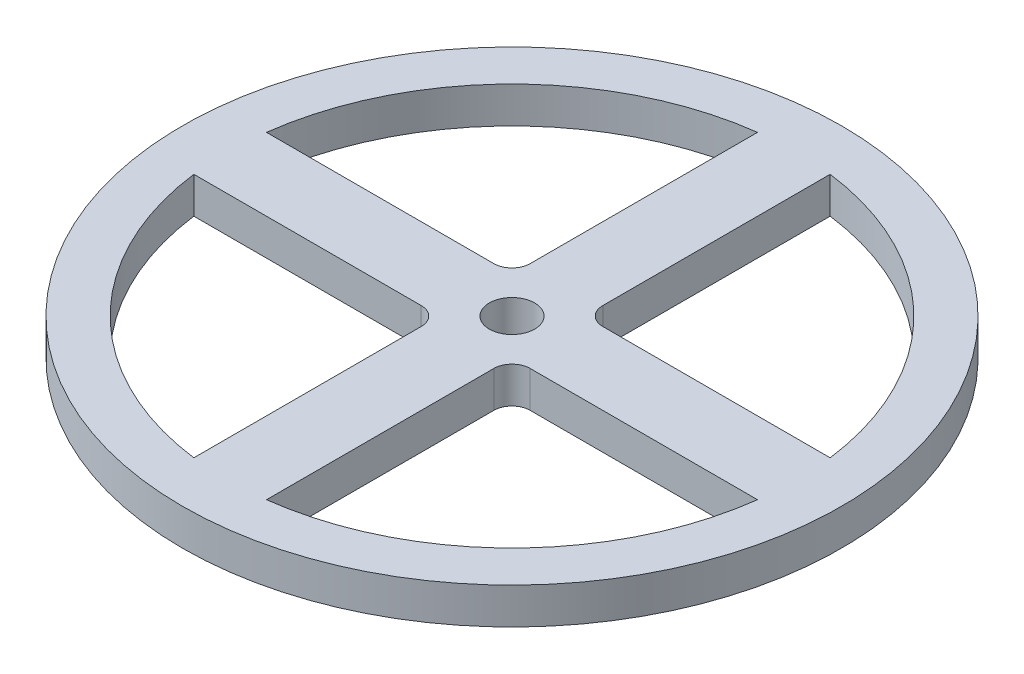
ISO-10303-21;
HEADER;
FILE_DESCRIPTION(('STEP AP214'),'2;1');
FILE_NAME('part.step','',(''),(''),'','','');
FILE_SCHEMA(('AUTOMOTIVE_DESIGN { 1 0 10303 214 1 1 1 1 }'));
ENDSEC;
DATA;
#1=APPLICATION_CONTEXT('core data for automotive mechanical design processes');
#2=APPLICATION_PROTOCOL_DEFINITION('international standard','automotive_design',2000,#1);
#3=PRODUCT_CONTEXT('',#1,'mechanical');
#4=PRODUCT('Part','Part','',(#3));
#5=PRODUCT_RELATED_PRODUCT_CATEGORY('part','',(#4));
#6=PRODUCT_DEFINITION_FORMATION('','',#4);
#7=PRODUCT_DEFINITION_CONTEXT('part definition',#1,'design');
#8=PRODUCT_DEFINITION('design','',#6,#7);
#9=PRODUCT_DEFINITION_SHAPE('','',#8);
#10=(LENGTH_UNIT() NAMED_UNIT(*) SI_UNIT(.MILLI.,.METRE.));
#11=(NAMED_UNIT(*) PLANE_ANGLE_UNIT() SI_UNIT($,.RADIAN.));
#12=(NAMED_UNIT(*) SI_UNIT($,.STERADIAN.) SOLID_ANGLE_UNIT());
#13=UNCERTAINTY_MEASURE_WITH_UNIT(LENGTH_MEASURE(1.E-05),#10,'distance_accuracy_value','');
#14=(GEOMETRIC_REPRESENTATION_CONTEXT(3) GLOBAL_UNCERTAINTY_ASSIGNED_CONTEXT((#13)) GLOBAL_UNIT_ASSIGNED_CONTEXT((#10,
#11,#12)) REPRESENTATION_CONTEXT('',''));
#15=CARTESIAN_POINT('',(0.,0.,0.));
#16=DIRECTION('',(0.,0.,1.));
#17=DIRECTION('',(1.,0.,0.));
#18=AXIS2_PLACEMENT_3D('',#15,#16,#17);
#19=CARTESIAN_POINT('',(0.,4.,4.));
#20=DIRECTION('',(0.,0.,-1.));
#21=DIRECTION('',(-1.,0.,0.));
#22=AXIS2_PLACEMENT_3D('',#19,#20,#21);
#23=PLANE('',#22);
#24=DIRECTION('',(1.,0.,0.));
#25=VECTOR('',#24,1.);
#26=CARTESIAN_POINT('',(0.,0.,4.));
#27=LINE('',#26,#25);
#28=CARTESIAN_POINT('',(-31.0433567772559,0.,4.));
#29=VERTEX_POINT('',#28);
#30=CARTESIAN_POINT('',(-5.99999999999999,0.,4.));
#31=VERTEX_POINT('',#30);
#32=EDGE_CURVE('E222',#29,#31,#27,.T.);
#33=ORIENTED_EDGE('',*,*,#32,.T.);
#34=DIRECTION('',(0.,-1.,0.));
#35=VECTOR('',#34,1.);
#36=CARTESIAN_POINT('',(-5.99999999999999,4.,4.));
#37=LINE('',#36,#35);
#38=CARTESIAN_POINT('',(-5.99999999999999,4.,4.));
#39=VERTEX_POINT('',#38);
#40=EDGE_CURVE('E11',#39,#31,#37,.T.);
#41=ORIENTED_EDGE('',*,*,#40,.F.);
#42=DIRECTION('',(1.,0.,0.));
#43=VECTOR('',#42,1.);
#44=CARTESIAN_POINT('',(0.,4.,4.));
#45=LINE('',#44,#43);
#46=CARTESIAN_POINT('',(-31.0433567772559,4.,4.));
#47=VERTEX_POINT('',#46);
#48=EDGE_CURVE('E163',#47,#39,#45,.T.);
#49=ORIENTED_EDGE('',*,*,#48,.F.);
#50=DIRECTION('',(0.,-1.,0.));
#51=VECTOR('',#50,1.);
#52=CARTESIAN_POINT('',(-31.0433567772559,4.,4.));
#53=LINE('',#52,#51);
#54=EDGE_CURVE('E55',#47,#29,#53,.T.);
#55=ORIENTED_EDGE('',*,*,#54,.T.);
#56=EDGE_LOOP('',(#33,#41,#49,#55));
#57=FACE_BOUND('',#56,.T.);
#58=ADVANCED_FACE('F36',(#57),#23,.F.);
#59=CARTESIAN_POINT('',(-5.99999999999999,4.,6.));
#60=DIRECTION('',(0.,-1.,0.));
#61=DIRECTION('',(0.,0.,-1.));
#62=AXIS2_PLACEMENT_3D('',#59,#60,#61);
#63=CYLINDRICAL_SURFACE('',#62,2.);
#64=CARTESIAN_POINT('',(-5.99999999999999,0.,6.));
#65=DIRECTION('',(0.,1.,0.));
#66=DIRECTION('',(0.,0.,1.));
#67=AXIS2_PLACEMENT_3D('',#64,#65,#66);
#68=CIRCLE('',#67,2.);
#69=CARTESIAN_POINT('',(-3.99999999999999,0.,6.));
#70=VERTEX_POINT('',#69);
#71=EDGE_CURVE('E169',#31,#70,#68,.F.);
#72=ORIENTED_EDGE('',*,*,#71,.T.);
#73=DIRECTION('',(0.,-1.,0.));
#74=VECTOR('',#73,1.);
#75=CARTESIAN_POINT('',(-3.99999999999999,4.,6.));
#76=LINE('',#75,#74);
#77=CARTESIAN_POINT('',(-3.99999999999999,4.,6.));
#78=VERTEX_POINT('',#77);
#79=EDGE_CURVE('E46',#78,#70,#76,.T.);
#80=ORIENTED_EDGE('',*,*,#79,.F.);
#81=CARTESIAN_POINT('',(-5.99999999999999,4.,6.));
#82=DIRECTION('',(0.,1.,0.));
#83=DIRECTION('',(0.,0.,1.));
#84=AXIS2_PLACEMENT_3D('',#81,#82,#83);
#85=CIRCLE('',#84,2.);
#86=EDGE_CURVE('E157',#39,#78,#85,.F.);
#87=ORIENTED_EDGE('',*,*,#86,.F.);
#88=ORIENTED_EDGE('',*,*,#40,.T.);
#89=EDGE_LOOP('',(#72,#80,#87,#88));
#90=FACE_BOUND('',#89,.T.);
#91=ADVANCED_FACE('F168',(#90),#63,.F.);
#92=CARTESIAN_POINT('',(-3.99999999999999,4.,0.));
#93=DIRECTION('',(1.,0.,0.));
#94=DIRECTION('',(0.,0.,-1.));
#95=AXIS2_PLACEMENT_3D('',#92,#93,#94);
#96=PLANE('',#95);
#97=DIRECTION('',(0.,0.,1.));
#98=VECTOR('',#97,1.);
#99=CARTESIAN_POINT('',(-3.99999999999999,0.,0.));
#100=LINE('',#99,#98);
#101=CARTESIAN_POINT('',(-3.99999999999999,0.,31.0433567772559));
#102=VERTEX_POINT('',#101);
#103=EDGE_CURVE('E225',#70,#102,#100,.T.);
#104=ORIENTED_EDGE('',*,*,#103,.T.);
#105=DIRECTION('',(0.,-1.,0.));
#106=VECTOR('',#105,1.);
#107=CARTESIAN_POINT('',(-3.99999999999999,4.,31.0433567772559));
#108=LINE('',#107,#106);
#109=CARTESIAN_POINT('',(-3.99999999999999,4.,31.0433567772559));
#110=VERTEX_POINT('',#109);
#111=EDGE_CURVE('E106',#110,#102,#108,.T.);
#112=ORIENTED_EDGE('',*,*,#111,.F.);
#113=DIRECTION('',(0.,0.,1.));
#114=VECTOR('',#113,1.);
#115=CARTESIAN_POINT('',(-3.99999999999999,4.,0.));
#116=LINE('',#115,#114);
#117=EDGE_CURVE('E162',#78,#110,#116,.T.);
#118=ORIENTED_EDGE('',*,*,#117,.F.);
#119=ORIENTED_EDGE('',*,*,#79,.T.);
#120=EDGE_LOOP('',(#104,#112,#118,#119));
#121=FACE_BOUND('',#120,.T.);
#122=ADVANCED_FACE('F173',(#121),#96,.F.);
#123=CARTESIAN_POINT('',(0.,4.,0.));
#124=DIRECTION('',(0.,-1.,0.));
#125=DIRECTION('',(0.,0.,-1.));
#126=AXIS2_PLACEMENT_3D('',#123,#124,#125);
#127=CYLINDRICAL_SURFACE('',#126,31.3);
#128=CARTESIAN_POINT('',(0.,0.,0.));
#129=DIRECTION('',(0.,1.,0.));
#130=DIRECTION('',(0.,0.,1.));
#131=AXIS2_PLACEMENT_3D('',#128,#129,#130);
#132=CIRCLE('',#131,31.3);
#133=CARTESIAN_POINT('',(-3.99999999999999,0.,-31.0433567772559));
#134=VERTEX_POINT('',#133);
#135=CARTESIAN_POINT('',(-31.0433567772559,0.,-4.));
#136=VERTEX_POINT('',#135);
#137=EDGE_CURVE('E204',#134,#136,#132,.T.);
#138=ORIENTED_EDGE('',*,*,#137,.F.);
#139=DIRECTION('',(0.,-1.,0.));
#140=VECTOR('',#139,1.);
#141=CARTESIAN_POINT('',(-3.99999999999999,4.,-31.0433567772559));
#142=LINE('',#141,#140);
#143=CARTESIAN_POINT('',(-3.99999999999999,4.,-31.0433567772559));
#144=VERTEX_POINT('',#143);
#145=EDGE_CURVE('E232',#144,#134,#142,.T.);
#146=ORIENTED_EDGE('',*,*,#145,.F.);
#147=CARTESIAN_POINT('',(0.,4.,0.));
#148=DIRECTION('',(0.,1.,0.));
#149=DIRECTION('',(0.,0.,1.));
#150=AXIS2_PLACEMENT_3D('',#147,#148,#149);
#151=CIRCLE('',#150,31.3);
#152=CARTESIAN_POINT('',(-31.0433567772559,4.,-4.));
#153=VERTEX_POINT('',#152);
#154=EDGE_CURVE('E292',#144,#153,#151,.T.);
#155=ORIENTED_EDGE('',*,*,#154,.T.);
#156=DIRECTION('',(0.,-1.,0.));
#157=VECTOR('',#156,1.);
#158=CARTESIAN_POINT('',(-31.0433567772559,4.,-4.));
#159=LINE('',#158,#157);
#160=EDGE_CURVE('E234',#153,#136,#159,.T.);
#161=ORIENTED_EDGE('',*,*,#160,.T.);
#162=EDGE_LOOP('',(#138,#146,#155,#161));
#163=FACE_BOUND('',#162,.T.);
#164=ADVANCED_FACE('F354',(#163),#127,.F.);
#165=CARTESIAN_POINT('',(-4.,4.,0.));
#166=DIRECTION('',(1.,0.,0.));
#167=DIRECTION('',(0.,0.,-1.));
#168=AXIS2_PLACEMENT_3D('',#165,#166,#167);
#169=PLANE('',#168);
#170=DIRECTION('',(0.,0.,1.));
#171=VECTOR('',#170,1.);
#172=CARTESIAN_POINT('',(-4.,0.,0.));
#173=LINE('',#172,#171);
#174=CARTESIAN_POINT('',(-3.99999999999999,0.,-6.));
#175=VERTEX_POINT('',#174);
#176=EDGE_CURVE('E207',#134,#175,#173,.T.);
#177=ORIENTED_EDGE('',*,*,#176,.T.);
#178=DIRECTION('',(0.,-1.,0.));
#179=VECTOR('',#178,1.);
#180=CARTESIAN_POINT('',(-3.99999999999999,4.,-6.));
#181=LINE('',#180,#179);
#182=CARTESIAN_POINT('',(-3.99999999999999,4.,-6.));
#183=VERTEX_POINT('',#182);
#184=EDGE_CURVE('E239',#183,#175,#181,.T.);
#185=ORIENTED_EDGE('',*,*,#184,.F.);
#186=DIRECTION('',(0.,0.,1.));
#187=VECTOR('',#186,1.);
#188=CARTESIAN_POINT('',(-4.,4.,0.));
#189=LINE('',#188,#187);
#190=EDGE_CURVE('E295',#144,#183,#189,.T.);
#191=ORIENTED_EDGE('',*,*,#190,.F.);
#192=ORIENTED_EDGE('',*,*,#145,.T.);
#193=EDGE_LOOP('',(#177,#185,#191,#192));
#194=FACE_BOUND('',#193,.T.);
#195=ADVANCED_FACE('F350',(#194),#169,.F.);
#196=CARTESIAN_POINT('',(-5.99999999999999,4.,-6.));
#197=DIRECTION('',(0.,-1.,0.));
#198=DIRECTION('',(0.,0.,-1.));
#199=AXIS2_PLACEMENT_3D('',#196,#197,#198);
#200=CYLINDRICAL_SURFACE('',#199,2.);
#201=CARTESIAN_POINT('',(-5.99999999999999,0.,-6.));
#202=DIRECTION('',(0.,1.,0.));
#203=DIRECTION('',(0.,0.,1.));
#204=AXIS2_PLACEMENT_3D('',#201,#202,#203);
#205=CIRCLE('',#204,2.);
#206=CARTESIAN_POINT('',(-5.99999999999999,0.,-4.));
#207=VERTEX_POINT('',#206);
#208=EDGE_CURVE('E210',#207,#175,#205,.T.);
#209=ORIENTED_EDGE('',*,*,#208,.F.);
#210=DIRECTION('',(0.,-1.,0.));
#211=VECTOR('',#210,1.);
#212=CARTESIAN_POINT('',(-5.99999999999999,4.,-4.));
#213=LINE('',#212,#211);
#214=CARTESIAN_POINT('',(-5.99999999999999,4.,-4.));
#215=VERTEX_POINT('',#214);
#216=EDGE_CURVE('E236',#215,#207,#213,.T.);
#217=ORIENTED_EDGE('',*,*,#216,.F.);
#218=CARTESIAN_POINT('',(-5.99999999999999,4.,-6.));
#219=DIRECTION('',(0.,1.,0.));
#220=DIRECTION('',(0.,0.,1.));
#221=AXIS2_PLACEMENT_3D('',#218,#219,#220);
#222=CIRCLE('',#221,2.);
#223=EDGE_CURVE('E297',#215,#183,#222,.T.);
#224=ORIENTED_EDGE('',*,*,#223,.T.);
#225=ORIENTED_EDGE('',*,*,#184,.T.);
#226=EDGE_LOOP('',(#209,#217,#224,#225));
#227=FACE_BOUND('',#226,.T.);
#228=ADVANCED_FACE('F346',(#227),#200,.F.);
#229=CARTESIAN_POINT('',(0.,4.,0.));
#230=DIRECTION('',(0.,-1.,0.));
#231=DIRECTION('',(0.,0.,-1.));
#232=AXIS2_PLACEMENT_3D('',#229,#230,#231);
#233=CYLINDRICAL_SURFACE('',#232,31.3);
#234=CARTESIAN_POINT('',(0.,0.,0.));
#235=DIRECTION('',(0.,1.,0.));
#236=DIRECTION('',(0.,0.,1.));
#237=AXIS2_PLACEMENT_3D('',#234,#235,#236);
#238=CIRCLE('',#237,31.3);
#239=CARTESIAN_POINT('',(31.0433567772559,0.,-4.));
#240=VERTEX_POINT('',#239);
#241=CARTESIAN_POINT('',(4.00000000000001,0.,-31.0433567772559));
#242=VERTEX_POINT('',#241);
#243=EDGE_CURVE('E192',#240,#242,#238,.T.);
#244=ORIENTED_EDGE('',*,*,#243,.F.);
#245=DIRECTION('',(0.,-1.,0.));
#246=VECTOR('',#245,1.);
#247=CARTESIAN_POINT('',(31.0433567772559,4.,-4.));
#248=LINE('',#247,#246);
#249=CARTESIAN_POINT('',(31.0433567772559,4.,-4.));
#250=VERTEX_POINT('',#249);
#251=EDGE_CURVE('E237',#250,#240,#248,.T.);
#252=ORIENTED_EDGE('',*,*,#251,.F.);
#253=CARTESIAN_POINT('',(0.,4.,0.));
#254=DIRECTION('',(0.,1.,0.));
#255=DIRECTION('',(0.,0.,1.));
#256=AXIS2_PLACEMENT_3D('',#253,#254,#255);
#257=CIRCLE('',#256,31.3);
#258=CARTESIAN_POINT('',(4.00000000000001,4.,-31.0433567772559));
#259=VERTEX_POINT('',#258);
#260=EDGE_CURVE('E274',#250,#259,#257,.T.);
#261=ORIENTED_EDGE('',*,*,#260,.T.);
#262=DIRECTION('',(0.,-1.,0.));
#263=VECTOR('',#262,1.);
#264=CARTESIAN_POINT('',(4.00000000000001,4.,-31.0433567772559));
#265=LINE('',#264,#263);
#266=EDGE_CURVE('E242',#259,#242,#265,.T.);
#267=ORIENTED_EDGE('',*,*,#266,.T.);
#268=EDGE_LOOP('',(#244,#252,#261,#267));
#269=FACE_BOUND('',#268,.T.);
#270=ADVANCED_FACE('F349',(#269),#233,.F.);
#271=CARTESIAN_POINT('',(0.,4.,-4.));
#272=DIRECTION('',(0.,0.,-1.));
#273=DIRECTION('',(-1.,0.,0.));
#274=AXIS2_PLACEMENT_3D('',#271,#272,#273);
#275=PLANE('',#274);
#276=DIRECTION('',(1.,0.,0.));
#277=VECTOR('',#276,1.);
#278=CARTESIAN_POINT('',(0.,0.,-4.));
#279=LINE('',#278,#277);
#280=CARTESIAN_POINT('',(6.00000000000001,0.,-4.));
#281=VERTEX_POINT('',#280);
#282=EDGE_CURVE('E195',#281,#240,#279,.T.);
#283=ORIENTED_EDGE('',*,*,#282,.F.);
#284=DIRECTION('',(0.,-1.,0.));
#285=VECTOR('',#284,1.);
#286=CARTESIAN_POINT('',(6.00000000000001,4.,-4.));
#287=LINE('',#286,#285);
#288=CARTESIAN_POINT('',(6.00000000000001,4.,-4.));
#289=VERTEX_POINT('',#288);
#290=EDGE_CURVE('E246',#289,#281,#287,.T.);
#291=ORIENTED_EDGE('',*,*,#290,.F.);
#292=DIRECTION('',(1.,0.,0.));
#293=VECTOR('',#292,1.);
#294=CARTESIAN_POINT('',(0.,4.,-4.));
#295=LINE('',#294,#293);
#296=EDGE_CURVE('E283',#289,#250,#295,.T.);
#297=ORIENTED_EDGE('',*,*,#296,.T.);
#298=ORIENTED_EDGE('',*,*,#251,.T.);
#299=EDGE_LOOP('',(#283,#291,#297,#298));
#300=FACE_BOUND('',#299,.T.);
#301=ADVANCED_FACE('F365',(#300),#275,.T.);
#302=CARTESIAN_POINT('',(6.00000000000001,4.,-6.));
#303=DIRECTION('',(0.,-1.,0.));
#304=DIRECTION('',(0.,0.,-1.));
#305=AXIS2_PLACEMENT_3D('',#302,#303,#304);
#306=CYLINDRICAL_SURFACE('',#305,2.);
#307=CARTESIAN_POINT('',(6.00000000000001,0.,-6.));
#308=DIRECTION('',(0.,1.,0.));
#309=DIRECTION('',(0.,0.,1.));
#310=AXIS2_PLACEMENT_3D('',#307,#308,#309);
#311=CIRCLE('',#310,2.);
#312=CARTESIAN_POINT('',(4.00000000000001,0.,-6.));
#313=VERTEX_POINT('',#312);
#314=EDGE_CURVE('E198',#313,#281,#311,.T.);
#315=ORIENTED_EDGE('',*,*,#314,.F.);
#316=DIRECTION('',(0.,-1.,0.));
#317=VECTOR('',#316,1.);
#318=CARTESIAN_POINT('',(4.00000000000001,4.,-6.));
#319=LINE('',#318,#317);
#320=CARTESIAN_POINT('',(4.00000000000001,4.,-6.));
#321=VERTEX_POINT('',#320);
#322=EDGE_CURVE('E244',#321,#313,#319,.T.);
#323=ORIENTED_EDGE('',*,*,#322,.F.);
#324=CARTESIAN_POINT('',(6.00000000000001,4.,-6.));
#325=DIRECTION('',(0.,1.,0.));
#326=DIRECTION('',(0.,0.,1.));
#327=AXIS2_PLACEMENT_3D('',#324,#325,#326);
#328=CIRCLE('',#327,2.);
#329=EDGE_CURVE('E286',#321,#289,#328,.T.);
#330=ORIENTED_EDGE('',*,*,#329,.T.);
#331=ORIENTED_EDGE('',*,*,#290,.T.);
#332=EDGE_LOOP('',(#315,#323,#330,#331));
#333=FACE_BOUND('',#332,.T.);
#334=ADVANCED_FACE('F362',(#333),#306,.F.);
#335=CARTESIAN_POINT('',(0.,4.,0.));
#336=DIRECTION('',(0.,-1.,0.));
#337=DIRECTION('',(0.,0.,-1.));
#338=AXIS2_PLACEMENT_3D('',#335,#336,#337);
#339=CYLINDRICAL_SURFACE('',#338,31.3);
#340=CARTESIAN_POINT('',(0.,0.,0.));
#341=DIRECTION('',(0.,1.,0.));
#342=DIRECTION('',(0.,0.,1.));
#343=AXIS2_PLACEMENT_3D('',#340,#341,#342);
#344=CIRCLE('',#343,31.3);
#345=CARTESIAN_POINT('',(4.00000000000001,0.,31.0433567772559));
#346=VERTEX_POINT('',#345);
#347=CARTESIAN_POINT('',(31.0433567772559,0.,4.));
#348=VERTEX_POINT('',#347);
#349=EDGE_CURVE('E180',#346,#348,#344,.T.);
#350=ORIENTED_EDGE('',*,*,#349,.F.);
#351=DIRECTION('',(0.,-1.,0.));
#352=VECTOR('',#351,1.);
#353=CARTESIAN_POINT('',(4.00000000000001,4.,31.0433567772559));
#354=LINE('',#353,#352);
#355=CARTESIAN_POINT('',(4.00000000000001,4.,31.0433567772559));
#356=VERTEX_POINT('',#355);
#357=EDGE_CURVE('E40',#356,#346,#354,.T.);
#358=ORIENTED_EDGE('',*,*,#357,.F.);
#359=CARTESIAN_POINT('',(0.,4.,0.));
#360=DIRECTION('',(0.,1.,0.));
#361=DIRECTION('',(0.,0.,1.));
#362=AXIS2_PLACEMENT_3D('',#359,#360,#361);
#363=CIRCLE('',#362,31.3);
#364=CARTESIAN_POINT('',(31.0433567772559,4.,4.));
#365=VERTEX_POINT('',#364);
#366=EDGE_CURVE('E230',#356,#365,#363,.T.);
#367=ORIENTED_EDGE('',*,*,#366,.T.);
#368=DIRECTION('',(0.,-1.,0.));
#369=VECTOR('',#368,1.);
#370=CARTESIAN_POINT('',(31.0433567772559,4.,4.));
#371=LINE('',#370,#369);
#372=EDGE_CURVE('E176',#365,#348,#371,.T.);
#373=ORIENTED_EDGE('',*,*,#372,.T.);
#374=EDGE_LOOP('',(#350,#358,#367,#373));
#375=FACE_BOUND('',#374,.T.);
#376=ADVANCED_FACE('F38',(#375),#339,.F.);
#377=CARTESIAN_POINT('',(4.00000000000001,4.,0.));
#378=DIRECTION('',(1.,0.,0.));
#379=DIRECTION('',(0.,0.,-1.));
#380=AXIS2_PLACEMENT_3D('',#377,#378,#379);
#381=PLANE('',#380);
#382=DIRECTION('',(0.,0.,1.));
#383=VECTOR('',#382,1.);
#384=CARTESIAN_POINT('',(4.00000000000001,0.,0.));
#385=LINE('',#384,#383);
#386=CARTESIAN_POINT('',(4.00000000000001,0.,6.));
#387=VERTEX_POINT('',#386);
#388=EDGE_CURVE('E183',#387,#346,#385,.T.);
#389=ORIENTED_EDGE('',*,*,#388,.F.);
#390=DIRECTION('',(0.,-1.,0.));
#391=VECTOR('',#390,1.);
#392=CARTESIAN_POINT('',(4.00000000000001,4.,6.));
#393=LINE('',#392,#391);
#394=CARTESIAN_POINT('',(4.00000000000001,4.,6.));
#395=VERTEX_POINT('',#394);
#396=EDGE_CURVE('E251',#395,#387,#393,.T.);
#397=ORIENTED_EDGE('',*,*,#396,.F.);
#398=DIRECTION('',(0.,0.,1.));
#399=VECTOR('',#398,1.);
#400=CARTESIAN_POINT('',(4.00000000000001,4.,0.));
#401=LINE('',#400,#399);
#402=EDGE_CURVE('E260',#395,#356,#401,.T.);
#403=ORIENTED_EDGE('',*,*,#402,.T.);
#404=ORIENTED_EDGE('',*,*,#357,.T.);
#405=EDGE_LOOP('',(#389,#397,#403,#404));
#406=FACE_BOUND('',#405,.T.);
#407=ADVANCED_FACE('F258',(#406),#381,.T.);
#408=CARTESIAN_POINT('',(6.00000000000001,4.,6.));
#409=DIRECTION('',(0.,-1.,0.));
#410=DIRECTION('',(0.,0.,-1.));
#411=AXIS2_PLACEMENT_3D('',#408,#409,#410);
#412=CYLINDRICAL_SURFACE('',#411,2.);
#413=CARTESIAN_POINT('',(6.00000000000001,0.,6.));
#414=DIRECTION('',(0.,1.,0.));
#415=DIRECTION('',(0.,0.,1.));
#416=AXIS2_PLACEMENT_3D('',#413,#414,#415);
#417=CIRCLE('',#416,2.);
#418=CARTESIAN_POINT('',(6.00000000000001,0.,4.));
#419=VERTEX_POINT('',#418);
#420=EDGE_CURVE('E186',#419,#387,#417,.T.);
#421=ORIENTED_EDGE('',*,*,#420,.F.);
#422=DIRECTION('',(0.,-1.,0.));
#423=VECTOR('',#422,1.);
#424=CARTESIAN_POINT('',(6.00000000000001,4.,4.));
#425=LINE('',#424,#423);
#426=CARTESIAN_POINT('',(6.00000000000001,4.,4.));
#427=VERTEX_POINT('',#426);
#428=EDGE_CURVE('E250',#427,#419,#425,.T.);
#429=ORIENTED_EDGE('',*,*,#428,.F.);
#430=CARTESIAN_POINT('',(6.00000000000001,4.,6.));
#431=DIRECTION('',(0.,1.,0.));
#432=DIRECTION('',(0.,0.,1.));
#433=AXIS2_PLACEMENT_3D('',#430,#431,#432);
#434=CIRCLE('',#433,2.);
#435=EDGE_CURVE('E269',#427,#395,#434,.T.);
#436=ORIENTED_EDGE('',*,*,#435,.T.);
#437=ORIENTED_EDGE('',*,*,#396,.T.);
#438=EDGE_LOOP('',(#421,#429,#436,#437));
#439=FACE_BOUND('',#438,.T.);
#440=ADVANCED_FACE('F266',(#439),#412,.F.);
#441=CARTESIAN_POINT('',(0.,4.,0.));
#442=DIRECTION('',(0.,-1.,0.));
#443=DIRECTION('',(0.,0.,-1.));
#444=AXIS2_PLACEMENT_3D('',#441,#442,#443);
#445=CYLINDRICAL_SURFACE('',#444,36.3);
#446=CARTESIAN_POINT('',(0.,4.,0.));
#447=DIRECTION('',(0.,1.,0.));
#448=DIRECTION('',(0.,0.,1.));
#449=AXIS2_PLACEMENT_3D('',#446,#447,#448);
#450=CIRCLE('',#449,36.3);
#451=CARTESIAN_POINT('',(0.,4.,36.3));
#452=VERTEX_POINT('',#451);
#453=EDGE_CURVE('E306',#452,#452,#450,.T.);
#454=ORIENTED_EDGE('',*,*,#453,.F.);
#455=EDGE_LOOP('',(#454));
#456=FACE_BOUND('',#455,.T.);
#457=CARTESIAN_POINT('',(0.,0.,0.));
#458=DIRECTION('',(0.,1.,0.));
#459=DIRECTION('',(0.,0.,1.));
#460=AXIS2_PLACEMENT_3D('',#457,#458,#459);
#461=CIRCLE('',#460,36.3);
#462=CARTESIAN_POINT('',(0.,0.,36.3));
#463=VERTEX_POINT('',#462);
#464=EDGE_CURVE('E219',#463,#463,#461,.T.);
#465=ORIENTED_EDGE('',*,*,#464,.T.);
#466=EDGE_LOOP('',(#465));
#467=FACE_BOUND('',#466,.T.);
#468=ADVANCED_FACE('F311',(#456,#467),#445,.T.);
#469=CARTESIAN_POINT('',(0.,4.,0.));
#470=DIRECTION('',(0.,-1.,0.));
#471=DIRECTION('',(0.,0.,-1.));
#472=AXIS2_PLACEMENT_3D('',#469,#470,#471);
#473=CYLINDRICAL_SURFACE('',#472,2.5);
#474=CARTESIAN_POINT('',(0.,4.,0.));
#475=DIRECTION('',(0.,1.,0.));
#476=DIRECTION('',(0.,0.,1.));
#477=AXIS2_PLACEMENT_3D('',#474,#475,#476);
#478=CIRCLE('',#477,2.5);
#479=CARTESIAN_POINT('',(0.,4.,2.5));
#480=VERTEX_POINT('',#479);
#481=EDGE_CURVE('E303',#480,#480,#478,.T.);
#482=ORIENTED_EDGE('',*,*,#481,.T.);
#483=EDGE_LOOP('',(#482));
#484=FACE_BOUND('',#483,.T.);
#485=CARTESIAN_POINT('',(0.,0.,0.));
#486=DIRECTION('',(0.,1.,0.));
#487=DIRECTION('',(0.,0.,1.));
#488=AXIS2_PLACEMENT_3D('',#485,#486,#487);
#489=CIRCLE('',#488,2.5);
#490=CARTESIAN_POINT('',(0.,0.,2.5));
#491=VERTEX_POINT('',#490);
#492=EDGE_CURVE('E216',#491,#491,#489,.T.);
#493=ORIENTED_EDGE('',*,*,#492,.F.);
#494=EDGE_LOOP('',(#493));
#495=FACE_BOUND('',#494,.T.);
#496=ADVANCED_FACE('F314',(#484,#495),#473,.F.);
#497=CARTESIAN_POINT('',(0.,4.,-4.));
#498=DIRECTION('',(0.,0.,-1.));
#499=DIRECTION('',(-1.,0.,0.));
#500=AXIS2_PLACEMENT_3D('',#497,#498,#499);
#501=PLANE('',#500);
#502=DIRECTION('',(1.,0.,0.));
#503=VECTOR('',#502,1.);
#504=CARTESIAN_POINT('',(0.,0.,-4.));
#505=LINE('',#504,#503);
#506=EDGE_CURVE('E213',#136,#207,#505,.T.);
#507=ORIENTED_EDGE('',*,*,#506,.F.);
#508=ORIENTED_EDGE('',*,*,#160,.F.);
#509=DIRECTION('',(1.,0.,0.));
#510=VECTOR('',#509,1.);
#511=CARTESIAN_POINT('',(0.,4.,-4.));
#512=LINE('',#511,#510);
#513=EDGE_CURVE('E300',#153,#215,#512,.T.);
#514=ORIENTED_EDGE('',*,*,#513,.T.);
#515=ORIENTED_EDGE('',*,*,#216,.T.);
#516=EDGE_LOOP('',(#507,#508,#514,#515));
#517=FACE_BOUND('',#516,.T.);
#518=ADVANCED_FACE('F341',(#517),#501,.T.);
#519=CARTESIAN_POINT('',(4.,4.,0.));
#520=DIRECTION('',(1.,0.,0.));
#521=DIRECTION('',(0.,0.,-1.));
#522=AXIS2_PLACEMENT_3D('',#519,#520,#521);
#523=PLANE('',#522);
#524=DIRECTION('',(0.,0.,1.));
#525=VECTOR('',#524,1.);
#526=CARTESIAN_POINT('',(4.,0.,0.));
#527=LINE('',#526,#525);
#528=EDGE_CURVE('E201',#242,#313,#527,.T.);
#529=ORIENTED_EDGE('',*,*,#528,.F.);
#530=ORIENTED_EDGE('',*,*,#266,.F.);
#531=DIRECTION('',(0.,0.,1.));
#532=VECTOR('',#531,1.);
#533=CARTESIAN_POINT('',(4.,4.,0.));
#534=LINE('',#533,#532);
#535=EDGE_CURVE('E289',#259,#321,#534,.T.);
#536=ORIENTED_EDGE('',*,*,#535,.T.);
#537=ORIENTED_EDGE('',*,*,#322,.T.);
#538=EDGE_LOOP('',(#529,#530,#536,#537));
#539=FACE_BOUND('',#538,.T.);
#540=ADVANCED_FACE('F329',(#539),#523,.T.);
#541=CARTESIAN_POINT('',(0.,4.,4.));
#542=DIRECTION('',(0.,0.,-1.));
#543=DIRECTION('',(-1.,0.,0.));
#544=AXIS2_PLACEMENT_3D('',#541,#542,#543);
#545=PLANE('',#544);
#546=DIRECTION('',(1.,0.,0.));
#547=VECTOR('',#546,1.);
#548=CARTESIAN_POINT('',(0.,0.,4.));
#549=LINE('',#548,#547);
#550=EDGE_CURVE('E189',#419,#348,#549,.T.);
#551=ORIENTED_EDGE('',*,*,#550,.T.);
#552=ORIENTED_EDGE('',*,*,#372,.F.);
#553=DIRECTION('',(1.,0.,0.));
#554=VECTOR('',#553,1.);
#555=CARTESIAN_POINT('',(0.,4.,4.));
#556=LINE('',#555,#554);
#557=EDGE_CURVE('E271',#427,#365,#556,.T.);
#558=ORIENTED_EDGE('',*,*,#557,.F.);
#559=ORIENTED_EDGE('',*,*,#428,.T.);
#560=EDGE_LOOP('',(#551,#552,#558,#559));
#561=FACE_BOUND('',#560,.T.);
#562=ADVANCED_FACE('F272',(#561),#545,.F.);
#563=CARTESIAN_POINT('',(0.,4.,0.));
#564=DIRECTION('',(0.,-1.,0.));
#565=DIRECTION('',(0.,0.,-1.));
#566=AXIS2_PLACEMENT_3D('',#563,#564,#565);
#567=CYLINDRICAL_SURFACE('',#566,31.3);
#568=CARTESIAN_POINT('',(0.,0.,0.));
#569=DIRECTION('',(0.,1.,0.));
#570=DIRECTION('',(0.,0.,1.));
#571=AXIS2_PLACEMENT_3D('',#568,#569,#570);
#572=CIRCLE('',#571,31.3);
#573=EDGE_CURVE('E227',#29,#102,#572,.T.);
#574=ORIENTED_EDGE('',*,*,#573,.F.);
#575=ORIENTED_EDGE('',*,*,#54,.F.);
#576=CARTESIAN_POINT('',(0.,4.,0.));
#577=DIRECTION('',(0.,1.,0.));
#578=DIRECTION('',(0.,0.,1.));
#579=AXIS2_PLACEMENT_3D('',#576,#577,#578);
#580=CIRCLE('',#579,31.3);
#581=EDGE_CURVE('E174',#47,#110,#580,.T.);
#582=ORIENTED_EDGE('',*,*,#581,.T.);
#583=ORIENTED_EDGE('',*,*,#111,.T.);
#584=EDGE_LOOP('',(#574,#575,#582,#583));
#585=FACE_BOUND('',#584,.T.);
#586=ADVANCED_FACE('F321',(#585),#567,.F.);
#587=CARTESIAN_POINT('',(0.,4.,0.));
#588=DIRECTION('',(0.,1.,0.));
#589=DIRECTION('',(0.,0.,1.));
#590=AXIS2_PLACEMENT_3D('',#587,#588,#589);
#591=PLANE('',#590);
#592=ORIENTED_EDGE('',*,*,#366,.F.);
#593=ORIENTED_EDGE('',*,*,#402,.F.);
#594=ORIENTED_EDGE('',*,*,#435,.F.);
#595=ORIENTED_EDGE('',*,*,#557,.T.);
#596=EDGE_LOOP('',(#592,#593,#594,#595));
#597=FACE_BOUND('',#596,.T.);
#598=ORIENTED_EDGE('',*,*,#260,.F.);
#599=ORIENTED_EDGE('',*,*,#296,.F.);
#600=ORIENTED_EDGE('',*,*,#329,.F.);
#601=ORIENTED_EDGE('',*,*,#535,.F.);
#602=EDGE_LOOP('',(#598,#599,#600,#601));
#603=FACE_BOUND('',#602,.T.);
#604=ORIENTED_EDGE('',*,*,#154,.F.);
#605=ORIENTED_EDGE('',*,*,#190,.T.);
#606=ORIENTED_EDGE('',*,*,#223,.F.);
#607=ORIENTED_EDGE('',*,*,#513,.F.);
#608=EDGE_LOOP('',(#604,#605,#606,#607));
#609=FACE_BOUND('',#608,.T.);
#610=ORIENTED_EDGE('',*,*,#481,.F.);
#611=EDGE_LOOP('',(#610));
#612=FACE_BOUND('',#611,.T.);
#613=ORIENTED_EDGE('',*,*,#453,.T.);
#614=EDGE_LOOP('',(#613));
#615=FACE_BOUND('',#614,.T.);
#616=ORIENTED_EDGE('',*,*,#48,.T.);
#617=ORIENTED_EDGE('',*,*,#86,.T.);
#618=ORIENTED_EDGE('',*,*,#117,.T.);
#619=ORIENTED_EDGE('',*,*,#581,.F.);
#620=EDGE_LOOP('',(#616,#617,#618,#619));
#621=FACE_BOUND('',#620,.T.);
#622=ADVANCED_FACE('F159',(#597,#603,#609,#612,#615,#621),#591,.T.);
#623=CARTESIAN_POINT('',(0.,0.,0.));
#624=DIRECTION('',(0.,1.,0.));
#625=DIRECTION('',(0.,0.,1.));
#626=AXIS2_PLACEMENT_3D('',#623,#624,#625);
#627=PLANE('',#626);
#628=ORIENTED_EDGE('',*,*,#349,.T.);
#629=ORIENTED_EDGE('',*,*,#550,.F.);
#630=ORIENTED_EDGE('',*,*,#420,.T.);
#631=ORIENTED_EDGE('',*,*,#388,.T.);
#632=EDGE_LOOP('',(#628,#629,#630,#631));
#633=FACE_BOUND('',#632,.T.);
#634=ORIENTED_EDGE('',*,*,#243,.T.);
#635=ORIENTED_EDGE('',*,*,#528,.T.);
#636=ORIENTED_EDGE('',*,*,#314,.T.);
#637=ORIENTED_EDGE('',*,*,#282,.T.);
#638=EDGE_LOOP('',(#634,#635,#636,#637));
#639=FACE_BOUND('',#638,.T.);
#640=ORIENTED_EDGE('',*,*,#137,.T.);
#641=ORIENTED_EDGE('',*,*,#506,.T.);
#642=ORIENTED_EDGE('',*,*,#208,.T.);
#643=ORIENTED_EDGE('',*,*,#176,.F.);
#644=EDGE_LOOP('',(#640,#641,#642,#643));
#645=FACE_BOUND('',#644,.T.);
#646=ORIENTED_EDGE('',*,*,#492,.T.);
#647=EDGE_LOOP('',(#646));
#648=FACE_BOUND('',#647,.T.);
#649=ORIENTED_EDGE('',*,*,#464,.F.);
#650=EDGE_LOOP('',(#649));
#651=FACE_BOUND('',#650,.T.);
#652=ORIENTED_EDGE('',*,*,#32,.F.);
#653=ORIENTED_EDGE('',*,*,#573,.T.);
#654=ORIENTED_EDGE('',*,*,#103,.F.);
#655=ORIENTED_EDGE('',*,*,#71,.F.);
#656=EDGE_LOOP('',(#652,#653,#654,#655));
#657=FACE_BOUND('',#656,.T.);
#658=ADVANCED_FACE('F264',(#633,#639,#645,#648,#651,#657),#627,.F.);
#659=CLOSED_SHELL('',(#58,#91,#122,#164,#195,#228,#270,#301,#334,#376,#407,#440,#468,#496,#518,
#540,#562,#586,#622,#658));
#660=MANIFOLD_SOLID_BREP('B2',#659);
#661=ADVANCED_BREP_SHAPE_REPRESENTATION('',(#18,#660),#14);
#662=SHAPE_DEFINITION_REPRESENTATION(#9,#661);
ENDSEC;
END-ISO-10303-21;
